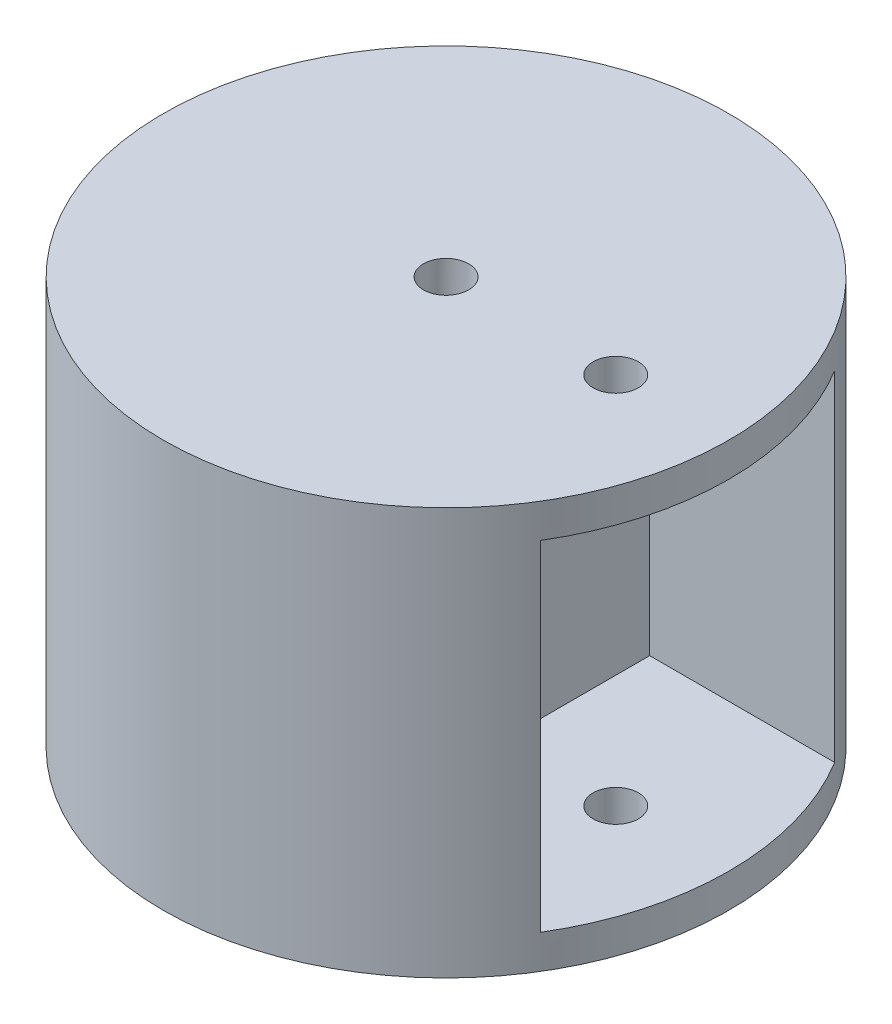
ISO-10303-21;
HEADER;
FILE_DESCRIPTION(('STEP AP214'),'2;1');
FILE_NAME('part.step','',(''),(''),'','','');
FILE_SCHEMA(('AUTOMOTIVE_DESIGN { 1 0 10303 214 1 1 1 1 }'));
ENDSEC;
DATA;
#1=APPLICATION_CONTEXT('core data for automotive mechanical design processes');
#2=APPLICATION_PROTOCOL_DEFINITION('international standard','automotive_design',2000,#1);
#3=PRODUCT_CONTEXT('',#1,'mechanical');
#4=PRODUCT('Part','Part','',(#3));
#5=PRODUCT_RELATED_PRODUCT_CATEGORY('part','',(#4));
#6=PRODUCT_DEFINITION_FORMATION('','',#4);
#7=PRODUCT_DEFINITION_CONTEXT('part definition',#1,'design');
#8=PRODUCT_DEFINITION('design','',#6,#7);
#9=PRODUCT_DEFINITION_SHAPE('','',#8);
#10=(LENGTH_UNIT() NAMED_UNIT(*) SI_UNIT(.MILLI.,.METRE.));
#11=(NAMED_UNIT(*) PLANE_ANGLE_UNIT() SI_UNIT($,.RADIAN.));
#12=(NAMED_UNIT(*) SI_UNIT($,.STERADIAN.) SOLID_ANGLE_UNIT());
#13=UNCERTAINTY_MEASURE_WITH_UNIT(LENGTH_MEASURE(1.E-05),#10,'distance_accuracy_value','');
#14=(GEOMETRIC_REPRESENTATION_CONTEXT(3) GLOBAL_UNCERTAINTY_ASSIGNED_CONTEXT((#13)) GLOBAL_UNIT_ASSIGNED_CONTEXT((#10,
#11,#12)) REPRESENTATION_CONTEXT('',''));
#15=CARTESIAN_POINT('',(0.,0.,0.));
#16=DIRECTION('',(0.,0.,1.));
#17=DIRECTION('',(1.,0.,0.));
#18=AXIS2_PLACEMENT_3D('',#15,#16,#17);
#19=CARTESIAN_POINT('',(7.5,18.,0.));
#20=DIRECTION('',(0.,-1.,0.));
#21=DIRECTION('',(0.,0.,-1.));
#22=AXIS2_PLACEMENT_3D('',#19,#20,#21);
#23=CYLINDRICAL_SURFACE('',#22,1.);
#24=CARTESIAN_POINT('',(7.5,1.5,0.));
#25=DIRECTION('',(0.,-1.,0.));
#26=DIRECTION('',(0.,0.,-1.));
#27=AXIS2_PLACEMENT_3D('',#24,#25,#26);
#28=CIRCLE('',#27,1.);
#29=CARTESIAN_POINT('',(7.5,1.5,-1.));
#30=VERTEX_POINT('',#29);
#31=EDGE_CURVE('E167',#30,#30,#28,.F.);
#32=ORIENTED_EDGE('',*,*,#31,.T.);
#33=EDGE_LOOP('',(#32));
#34=FACE_BOUND('',#33,.T.);
#35=CARTESIAN_POINT('',(7.5,0.,0.));
#36=DIRECTION('',(0.,-1.,0.));
#37=DIRECTION('',(0.,0.,-1.));
#38=AXIS2_PLACEMENT_3D('',#35,#36,#37);
#39=CIRCLE('',#38,1.);
#40=CARTESIAN_POINT('',(7.5,0.,-1.));
#41=VERTEX_POINT('',#40);
#42=EDGE_CURVE('E170',#41,#41,#39,.T.);
#43=ORIENTED_EDGE('',*,*,#42,.T.);
#44=EDGE_LOOP('',(#43));
#45=FACE_BOUND('',#44,.T.);
#46=ADVANCED_FACE('F36',(#34,#45),#23,.F.);
#47=CARTESIAN_POINT('',(0.,18.,0.));
#48=DIRECTION('',(0.,-1.,0.));
#49=DIRECTION('',(0.,0.,-1.));
#50=AXIS2_PLACEMENT_3D('',#47,#48,#49);
#51=CYLINDRICAL_SURFACE('',#50,12.5);
#52=DIRECTION('',(0.,-1.,0.));
#53=VECTOR('',#52,1.);
#54=CARTESIAN_POINT('',(10.6770782520313,18.,6.5));
#55=LINE('',#54,#53);
#56=CARTESIAN_POINT('',(10.6770782520313,1.5,6.5));
#57=VERTEX_POINT('',#56);
#58=CARTESIAN_POINT('',(10.6770782520313,16.5,6.5));
#59=VERTEX_POINT('',#58);
#60=EDGE_CURVE('E11',#57,#59,#55,.F.);
#61=ORIENTED_EDGE('',*,*,#60,.T.);
#62=CARTESIAN_POINT('',(0.,16.5,0.));
#63=DIRECTION('',(0.,1.,0.));
#64=DIRECTION('',(0.,0.,1.));
#65=AXIS2_PLACEMENT_3D('',#62,#63,#64);
#66=CIRCLE('',#65,12.5);
#67=CARTESIAN_POINT('',(10.6770782520313,16.5,-6.5));
#68=VERTEX_POINT('',#67);
#69=EDGE_CURVE('E59',#59,#68,#66,.T.);
#70=ORIENTED_EDGE('',*,*,#69,.T.);
#71=DIRECTION('',(0.,-1.,0.));
#72=VECTOR('',#71,1.);
#73=CARTESIAN_POINT('',(10.6770782520313,18.,-6.5));
#74=LINE('',#73,#72);
#75=CARTESIAN_POINT('',(10.6770782520313,1.5,-6.5));
#76=VERTEX_POINT('',#75);
#77=EDGE_CURVE('E45',#68,#76,#74,.T.);
#78=ORIENTED_EDGE('',*,*,#77,.T.);
#79=CARTESIAN_POINT('',(0.,1.5,0.));
#80=DIRECTION('',(0.,-1.,0.));
#81=DIRECTION('',(0.,0.,-1.));
#82=AXIS2_PLACEMENT_3D('',#79,#80,#81);
#83=CIRCLE('',#82,12.5);
#84=EDGE_CURVE('E168',#76,#57,#83,.T.);
#85=ORIENTED_EDGE('',*,*,#84,.T.);
#86=EDGE_LOOP('',(#61,#70,#78,#85));
#87=FACE_BOUND('',#86,.T.);
#88=CARTESIAN_POINT('',(0.,18.,0.));
#89=DIRECTION('',(0.,1.,0.));
#90=DIRECTION('',(0.,0.,1.));
#91=AXIS2_PLACEMENT_3D('',#88,#89,#90);
#92=CIRCLE('',#91,12.5);
#93=CARTESIAN_POINT('',(0.,18.,12.5));
#94=VERTEX_POINT('',#93);
#95=EDGE_CURVE('E177',#94,#94,#92,.T.);
#96=ORIENTED_EDGE('',*,*,#95,.F.);
#97=EDGE_LOOP('',(#96));
#98=FACE_BOUND('',#97,.T.);
#99=CARTESIAN_POINT('',(0.,0.,0.));
#100=DIRECTION('',(0.,1.,0.));
#101=DIRECTION('',(0.,0.,1.));
#102=AXIS2_PLACEMENT_3D('',#99,#100,#101);
#103=CIRCLE('',#102,12.5);
#104=CARTESIAN_POINT('',(0.,0.,12.5));
#105=VERTEX_POINT('',#104);
#106=EDGE_CURVE('E174',#105,#105,#103,.T.);
#107=ORIENTED_EDGE('',*,*,#106,.T.);
#108=EDGE_LOOP('',(#107));
#109=FACE_BOUND('',#108,.T.);
#110=ADVANCED_FACE('F38',(#87,#98,#109),#51,.T.);
#111=CARTESIAN_POINT('',(0.,18.,0.));
#112=DIRECTION('',(0.,1.,0.));
#113=DIRECTION('',(0.,0.,1.));
#114=AXIS2_PLACEMENT_3D('',#111,#112,#113);
#115=PLANE('',#114);
#116=CARTESIAN_POINT('',(0.,18.,0.));
#117=DIRECTION('',(0.,1.,0.));
#118=DIRECTION('',(0.,0.,1.));
#119=AXIS2_PLACEMENT_3D('',#116,#117,#118);
#120=CIRCLE('',#119,1.);
#121=CARTESIAN_POINT('',(0.,18.,1.));
#122=VERTEX_POINT('',#121);
#123=EDGE_CURVE('E128',#122,#122,#120,.T.);
#124=ORIENTED_EDGE('',*,*,#123,.F.);
#125=EDGE_LOOP('',(#124));
#126=FACE_BOUND('',#125,.T.);
#127=CARTESIAN_POINT('',(7.5,18.,0.));
#128=DIRECTION('',(0.,-1.,0.));
#129=DIRECTION('',(0.,0.,-1.));
#130=AXIS2_PLACEMENT_3D('',#127,#128,#129);
#131=CIRCLE('',#130,1.);
#132=CARTESIAN_POINT('',(7.5,18.,-1.));
#133=VERTEX_POINT('',#132);
#134=EDGE_CURVE('E171',#133,#133,#131,.T.);
#135=ORIENTED_EDGE('',*,*,#134,.T.);
#136=EDGE_LOOP('',(#135));
#137=FACE_BOUND('',#136,.T.);
#138=ORIENTED_EDGE('',*,*,#95,.T.);
#139=EDGE_LOOP('',(#138));
#140=FACE_BOUND('',#139,.T.);
#141=ADVANCED_FACE('F223',(#126,#137,#140),#115,.T.);
#142=CARTESIAN_POINT('',(0.,0.,0.));
#143=DIRECTION('',(0.,1.,0.));
#144=DIRECTION('',(0.,0.,1.));
#145=AXIS2_PLACEMENT_3D('',#142,#143,#144);
#146=PLANE('',#145);
#147=DIRECTION('',(-1.,0.,0.));
#148=VECTOR('',#147,1.);
#149=CARTESIAN_POINT('',(-1.4142135623731,0.,0.5));
#150=LINE('',#149,#148);
#151=CARTESIAN_POINT('',(-1.4142135623731,0.,0.5));
#152=VERTEX_POINT('',#151);
#153=CARTESIAN_POINT('',(-2.5142135623731,0.,0.5));
#154=VERTEX_POINT('',#153);
#155=EDGE_CURVE('E133',#152,#154,#150,.T.);
#156=ORIENTED_EDGE('',*,*,#155,.F.);
#157=CARTESIAN_POINT('',(0.,0.,0.));
#158=DIRECTION('',(0.,-1.,0.));
#159=DIRECTION('',(0.,0.,-1.));
#160=AXIS2_PLACEMENT_3D('',#157,#158,#159);
#161=CIRCLE('',#160,1.5);
#162=CARTESIAN_POINT('',(-1.4142135623731,0.,-0.5));
#163=VERTEX_POINT('',#162);
#164=EDGE_CURVE('E52',#163,#152,#161,.T.);
#165=ORIENTED_EDGE('',*,*,#164,.F.);
#166=DIRECTION('',(1.,0.,0.));
#167=VECTOR('',#166,1.);
#168=CARTESIAN_POINT('',(-1.4142135623731,0.,-0.5));
#169=LINE('',#168,#167);
#170=CARTESIAN_POINT('',(-2.5142135623731,0.,-0.5));
#171=VERTEX_POINT('',#170);
#172=EDGE_CURVE('E122',#171,#163,#169,.T.);
#173=ORIENTED_EDGE('',*,*,#172,.F.);
#174=DIRECTION('',(0.,0.,-1.));
#175=VECTOR('',#174,1.);
#176=CARTESIAN_POINT('',(-2.5142135623731,0.,0.5));
#177=LINE('',#176,#175);
#178=EDGE_CURVE('E125',#154,#171,#177,.T.);
#179=ORIENTED_EDGE('',*,*,#178,.F.);
#180=EDGE_LOOP('',(#156,#165,#173,#179));
#181=FACE_BOUND('',#180,.T.);
#182=ORIENTED_EDGE('',*,*,#42,.F.);
#183=EDGE_LOOP('',(#182));
#184=FACE_BOUND('',#183,.T.);
#185=ORIENTED_EDGE('',*,*,#106,.F.);
#186=EDGE_LOOP('',(#185));
#187=FACE_BOUND('',#186,.T.);
#188=ADVANCED_FACE('F227',(#181,#184,#187),#146,.F.);
#189=CARTESIAN_POINT('',(7.5,16.5,0.));
#190=DIRECTION('',(0.,1.,0.));
#191=DIRECTION('',(0.,0.,1.));
#192=AXIS2_PLACEMENT_3D('',#189,#190,#191);
#193=CIRCLE('',#192,1.);
#194=CARTESIAN_POINT('',(7.5,16.5,1.));
#195=VERTEX_POINT('',#194);
#196=EDGE_CURVE('E158',#195,#195,#193,.F.);
#197=ORIENTED_EDGE('',*,*,#196,.T.);
#198=EDGE_LOOP('',(#197));
#199=FACE_BOUND('',#198,.T.);
#200=ORIENTED_EDGE('',*,*,#134,.F.);
#201=EDGE_LOOP('',(#200));
#202=FACE_BOUND('',#201,.T.);
#203=ADVANCED_FACE('F219',(#199,#202),#23,.F.);
#204=CARTESIAN_POINT('',(2.5,16.5,-6.5));
#205=DIRECTION('',(0.,0.,-1.));
#206=DIRECTION('',(0.,1.,0.));
#207=AXIS2_PLACEMENT_3D('',#204,#205,#206);
#208=PLANE('',#207);
#209=DIRECTION('',(1.,0.,0.));
#210=VECTOR('',#209,1.);
#211=CARTESIAN_POINT('',(2.5,16.5,-6.5));
#212=LINE('',#211,#210);
#213=CARTESIAN_POINT('',(2.5,16.5,-6.5));
#214=VERTEX_POINT('',#213);
#215=EDGE_CURVE('E154',#214,#68,#212,.T.);
#216=ORIENTED_EDGE('',*,*,#215,.F.);
#217=DIRECTION('',(0.,1.,0.));
#218=VECTOR('',#217,1.);
#219=CARTESIAN_POINT('',(2.5,16.5,-6.5));
#220=LINE('',#219,#218);
#221=CARTESIAN_POINT('',(2.5,1.5,-6.5));
#222=VERTEX_POINT('',#221);
#223=EDGE_CURVE('E139',#222,#214,#220,.T.);
#224=ORIENTED_EDGE('',*,*,#223,.F.);
#225=DIRECTION('',(1.,0.,0.));
#226=VECTOR('',#225,1.);
#227=CARTESIAN_POINT('',(2.5,1.5,-6.5));
#228=LINE('',#227,#226);
#229=EDGE_CURVE('E155',#222,#76,#228,.T.);
#230=ORIENTED_EDGE('',*,*,#229,.T.);
#231=ORIENTED_EDGE('',*,*,#77,.F.);
#232=EDGE_LOOP('',(#216,#224,#230,#231));
#233=FACE_BOUND('',#232,.T.);
#234=ADVANCED_FACE('F190',(#233),#208,.F.);
#235=CARTESIAN_POINT('',(2.5,16.5,6.5));
#236=DIRECTION('',(0.,0.,1.));
#237=DIRECTION('',(0.,-1.,0.));
#238=AXIS2_PLACEMENT_3D('',#235,#236,#237);
#239=PLANE('',#238);
#240=DIRECTION('',(1.,0.,0.));
#241=VECTOR('',#240,1.);
#242=CARTESIAN_POINT('',(2.5,1.5,6.5));
#243=LINE('',#242,#241);
#244=CARTESIAN_POINT('',(2.5,1.5,6.5));
#245=VERTEX_POINT('',#244);
#246=EDGE_CURVE('E159',#245,#57,#243,.T.);
#247=ORIENTED_EDGE('',*,*,#246,.F.);
#248=DIRECTION('',(0.,-1.,0.));
#249=VECTOR('',#248,1.);
#250=CARTESIAN_POINT('',(2.5,16.5,6.5));
#251=LINE('',#250,#249);
#252=CARTESIAN_POINT('',(2.5,16.5,6.5));
#253=VERTEX_POINT('',#252);
#254=EDGE_CURVE('E148',#253,#245,#251,.T.);
#255=ORIENTED_EDGE('',*,*,#254,.F.);
#256=DIRECTION('',(1.,0.,0.));
#257=VECTOR('',#256,1.);
#258=CARTESIAN_POINT('',(2.5,16.5,6.5));
#259=LINE('',#258,#257);
#260=EDGE_CURVE('E162',#253,#59,#259,.T.);
#261=ORIENTED_EDGE('',*,*,#260,.T.);
#262=ORIENTED_EDGE('',*,*,#60,.F.);
#263=EDGE_LOOP('',(#247,#255,#261,#262));
#264=FACE_BOUND('',#263,.T.);
#265=ADVANCED_FACE('F198',(#264),#239,.F.);
#266=CARTESIAN_POINT('',(2.5,1.5,6.5));
#267=DIRECTION('',(0.,-1.,0.));
#268=DIRECTION('',(0.,0.,-1.));
#269=AXIS2_PLACEMENT_3D('',#266,#267,#268);
#270=PLANE('',#269);
#271=ORIENTED_EDGE('',*,*,#31,.F.);
#272=EDGE_LOOP('',(#271));
#273=FACE_BOUND('',#272,.T.);
#274=ORIENTED_EDGE('',*,*,#229,.F.);
#275=DIRECTION('',(0.,0.,-1.));
#276=VECTOR('',#275,1.);
#277=CARTESIAN_POINT('',(2.5,1.5,6.5));
#278=LINE('',#277,#276);
#279=EDGE_CURVE('E151',#245,#222,#278,.T.);
#280=ORIENTED_EDGE('',*,*,#279,.F.);
#281=ORIENTED_EDGE('',*,*,#246,.T.);
#282=ORIENTED_EDGE('',*,*,#84,.F.);
#283=EDGE_LOOP('',(#274,#280,#281,#282));
#284=FACE_BOUND('',#283,.T.);
#285=ADVANCED_FACE('F195',(#273,#284),#270,.F.);
#286=CARTESIAN_POINT('',(2.5,16.5,6.5));
#287=DIRECTION('',(0.,1.,0.));
#288=DIRECTION('',(0.,0.,1.));
#289=AXIS2_PLACEMENT_3D('',#286,#287,#288);
#290=PLANE('',#289);
#291=ORIENTED_EDGE('',*,*,#196,.F.);
#292=EDGE_LOOP('',(#291));
#293=FACE_BOUND('',#292,.T.);
#294=ORIENTED_EDGE('',*,*,#260,.F.);
#295=DIRECTION('',(0.,0.,1.));
#296=VECTOR('',#295,1.);
#297=CARTESIAN_POINT('',(2.5,16.5,6.5));
#298=LINE('',#297,#296);
#299=EDGE_CURVE('E145',#214,#253,#298,.T.);
#300=ORIENTED_EDGE('',*,*,#299,.F.);
#301=ORIENTED_EDGE('',*,*,#215,.T.);
#302=ORIENTED_EDGE('',*,*,#69,.F.);
#303=EDGE_LOOP('',(#294,#300,#301,#302));
#304=FACE_BOUND('',#303,.T.);
#305=ADVANCED_FACE('F202',(#293,#304),#290,.F.);
#306=CARTESIAN_POINT('',(2.5,0.,0.));
#307=DIRECTION('',(1.,0.,0.));
#308=DIRECTION('',(0.,0.,-1.));
#309=AXIS2_PLACEMENT_3D('',#306,#307,#308);
#310=PLANE('',#309);
#311=ORIENTED_EDGE('',*,*,#223,.T.);
#312=ORIENTED_EDGE('',*,*,#299,.T.);
#313=ORIENTED_EDGE('',*,*,#254,.T.);
#314=ORIENTED_EDGE('',*,*,#279,.T.);
#315=EDGE_LOOP('',(#311,#312,#313,#314));
#316=FACE_BOUND('',#315,.T.);
#317=ADVANCED_FACE('F200',(#316),#310,.T.);
#318=CARTESIAN_POINT('',(0.,16.,0.));
#319=DIRECTION('',(0.,-1.,0.));
#320=DIRECTION('',(0.,0.,-1.));
#321=AXIS2_PLACEMENT_3D('',#318,#319,#320);
#322=CYLINDRICAL_SURFACE('',#321,1.5);
#323=ORIENTED_EDGE('',*,*,#164,.T.);
#324=DIRECTION('',(0.,-1.,0.));
#325=VECTOR('',#324,1.);
#326=CARTESIAN_POINT('',(-1.4142135623731,16.,0.5));
#327=LINE('',#326,#325);
#328=CARTESIAN_POINT('',(-1.4142135623731,16.,0.5));
#329=VERTEX_POINT('',#328);
#330=EDGE_CURVE('E100',#329,#152,#327,.T.);
#331=ORIENTED_EDGE('',*,*,#330,.F.);
#332=CARTESIAN_POINT('',(0.,16.,0.));
#333=DIRECTION('',(0.,-1.,0.));
#334=DIRECTION('',(0.,0.,-1.));
#335=AXIS2_PLACEMENT_3D('',#332,#333,#334);
#336=CIRCLE('',#335,1.5);
#337=CARTESIAN_POINT('',(-1.4142135623731,16.,-0.5));
#338=VERTEX_POINT('',#337);
#339=EDGE_CURVE('E104',#338,#329,#336,.T.);
#340=ORIENTED_EDGE('',*,*,#339,.F.);
#341=DIRECTION('',(0.,-1.,0.));
#342=VECTOR('',#341,1.);
#343=CARTESIAN_POINT('',(-1.4142135623731,16.,-0.5));
#344=LINE('',#343,#342);
#345=EDGE_CURVE('E137',#338,#163,#344,.T.);
#346=ORIENTED_EDGE('',*,*,#345,.T.);
#347=EDGE_LOOP('',(#323,#331,#340,#346));
#348=FACE_BOUND('',#347,.T.);
#349=ADVANCED_FACE('F102',(#348),#322,.F.);
#350=CARTESIAN_POINT('',(-1.4142135623731,16.,-0.5));
#351=DIRECTION('',(0.,0.,-1.));
#352=DIRECTION('',(-1.,0.,0.));
#353=AXIS2_PLACEMENT_3D('',#350,#351,#352);
#354=PLANE('',#353);
#355=ORIENTED_EDGE('',*,*,#172,.T.);
#356=ORIENTED_EDGE('',*,*,#345,.F.);
#357=DIRECTION('',(1.,0.,0.));
#358=VECTOR('',#357,1.);
#359=CARTESIAN_POINT('',(-1.4142135623731,16.,-0.5));
#360=LINE('',#359,#358);
#361=CARTESIAN_POINT('',(-2.5142135623731,16.,-0.5));
#362=VERTEX_POINT('',#361);
#363=EDGE_CURVE('E110',#362,#338,#360,.T.);
#364=ORIENTED_EDGE('',*,*,#363,.F.);
#365=DIRECTION('',(0.,-1.,0.));
#366=VECTOR('',#365,1.);
#367=CARTESIAN_POINT('',(-2.5142135623731,16.,-0.5));
#368=LINE('',#367,#366);
#369=EDGE_CURVE('E140',#362,#171,#368,.T.);
#370=ORIENTED_EDGE('',*,*,#369,.T.);
#371=EDGE_LOOP('',(#355,#356,#364,#370));
#372=FACE_BOUND('',#371,.T.);
#373=ADVANCED_FACE('F264',(#372),#354,.F.);
#374=CARTESIAN_POINT('',(-2.5142135623731,16.,0.5));
#375=DIRECTION('',(-1.,0.,0.));
#376=DIRECTION('',(0.,0.,1.));
#377=AXIS2_PLACEMENT_3D('',#374,#375,#376);
#378=PLANE('',#377);
#379=ORIENTED_EDGE('',*,*,#178,.T.);
#380=ORIENTED_EDGE('',*,*,#369,.F.);
#381=DIRECTION('',(0.,0.,-1.));
#382=VECTOR('',#381,1.);
#383=CARTESIAN_POINT('',(-2.5142135623731,16.,0.5));
#384=LINE('',#383,#382);
#385=CARTESIAN_POINT('',(-2.5142135623731,16.,0.5));
#386=VERTEX_POINT('',#385);
#387=EDGE_CURVE('E118',#386,#362,#384,.T.);
#388=ORIENTED_EDGE('',*,*,#387,.F.);
#389=DIRECTION('',(0.,-1.,0.));
#390=VECTOR('',#389,1.);
#391=CARTESIAN_POINT('',(-2.5142135623731,16.,0.5));
#392=LINE('',#391,#390);
#393=EDGE_CURVE('E109',#386,#154,#392,.T.);
#394=ORIENTED_EDGE('',*,*,#393,.T.);
#395=EDGE_LOOP('',(#379,#380,#388,#394));
#396=FACE_BOUND('',#395,.T.);
#397=ADVANCED_FACE('F261',(#396),#378,.F.);
#398=CARTESIAN_POINT('',(-1.4142135623731,16.,0.5));
#399=DIRECTION('',(0.,0.,1.));
#400=DIRECTION('',(1.,0.,0.));
#401=AXIS2_PLACEMENT_3D('',#398,#399,#400);
#402=PLANE('',#401);
#403=ORIENTED_EDGE('',*,*,#155,.T.);
#404=ORIENTED_EDGE('',*,*,#393,.F.);
#405=DIRECTION('',(-1.,0.,0.));
#406=VECTOR('',#405,1.);
#407=CARTESIAN_POINT('',(-1.4142135623731,16.,0.5));
#408=LINE('',#407,#406);
#409=EDGE_CURVE('E113',#329,#386,#408,.T.);
#410=ORIENTED_EDGE('',*,*,#409,.F.);
#411=ORIENTED_EDGE('',*,*,#330,.T.);
#412=EDGE_LOOP('',(#403,#404,#410,#411));
#413=FACE_BOUND('',#412,.T.);
#414=ADVANCED_FACE('F114',(#413),#402,.F.);
#415=CARTESIAN_POINT('',(0.,16.,0.));
#416=DIRECTION('',(0.,-1.,0.));
#417=DIRECTION('',(0.,0.,-1.));
#418=AXIS2_PLACEMENT_3D('',#415,#416,#417);
#419=PLANE('',#418);
#420=CARTESIAN_POINT('',(0.,16.,0.));
#421=DIRECTION('',(0.,-1.,0.));
#422=DIRECTION('',(0.,0.,-1.));
#423=AXIS2_PLACEMENT_3D('',#420,#421,#422);
#424=CIRCLE('',#423,1.);
#425=CARTESIAN_POINT('',(0.,16.,-1.));
#426=VERTEX_POINT('',#425);
#427=EDGE_CURVE('E40',#426,#426,#424,.T.);
#428=ORIENTED_EDGE('',*,*,#427,.F.);
#429=EDGE_LOOP('',(#428));
#430=FACE_BOUND('',#429,.T.);
#431=ORIENTED_EDGE('',*,*,#339,.T.);
#432=ORIENTED_EDGE('',*,*,#409,.T.);
#433=ORIENTED_EDGE('',*,*,#387,.T.);
#434=ORIENTED_EDGE('',*,*,#363,.T.);
#435=EDGE_LOOP('',(#431,#432,#433,#434));
#436=FACE_BOUND('',#435,.T.);
#437=ADVANCED_FACE('F120',(#430,#436),#419,.T.);
#438=CARTESIAN_POINT('',(0.,1.99999999999999,0.));
#439=DIRECTION('',(0.,1.,0.));
#440=DIRECTION('',(0.,0.,1.));
#441=AXIS2_PLACEMENT_3D('',#438,#439,#440);
#442=CYLINDRICAL_SURFACE('',#441,1.);
#443=ORIENTED_EDGE('',*,*,#427,.T.);
#444=EDGE_LOOP('',(#443));
#445=FACE_BOUND('',#444,.T.);
#446=ORIENTED_EDGE('',*,*,#123,.T.);
#447=EDGE_LOOP('',(#446));
#448=FACE_BOUND('',#447,.T.);
#449=ADVANCED_FACE('F252',(#445,#448),#442,.F.);
#450=CLOSED_SHELL('',(#46,#110,#141,#188,#203,#234,#265,#285,#305,#317,#349,#373,#397,#414,#437,#449));
#451=MANIFOLD_SOLID_BREP('B2',#450);
#452=ADVANCED_BREP_SHAPE_REPRESENTATION('',(#18,#451),#14);
#453=SHAPE_DEFINITION_REPRESENTATION(#9,#452);
ENDSEC;
END-ISO-10303-21;
